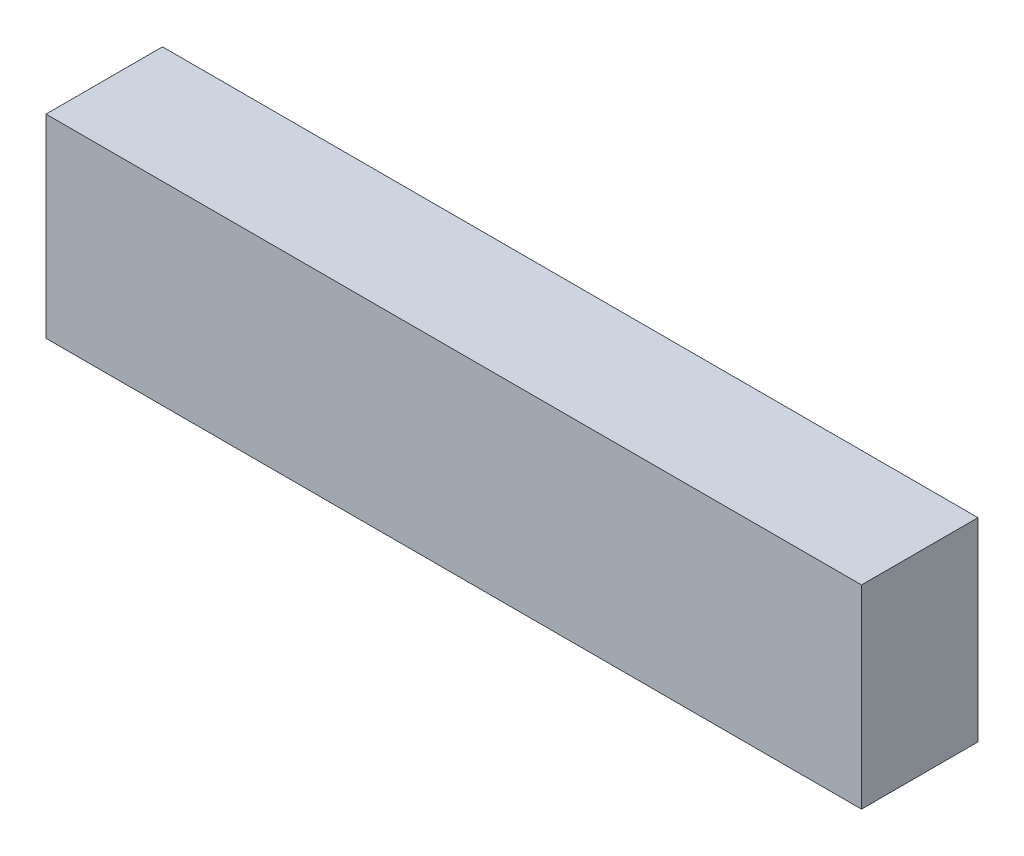
ISO-10303-21;
HEADER;
FILE_DESCRIPTION(('STEP AP214'),'2;1');
FILE_NAME('part.step','',(''),(''),'','','');
FILE_SCHEMA(('AUTOMOTIVE_DESIGN { 1 0 10303 214 1 1 1 1 }'));
ENDSEC;
DATA;
#1=APPLICATION_CONTEXT('core data for automotive mechanical design processes');
#2=APPLICATION_PROTOCOL_DEFINITION('international standard','automotive_design',2000,#1);
#3=PRODUCT_CONTEXT('',#1,'mechanical');
#4=PRODUCT('Part','Part','',(#3));
#5=PRODUCT_RELATED_PRODUCT_CATEGORY('part','',(#4));
#6=PRODUCT_DEFINITION_FORMATION('','',#4);
#7=PRODUCT_DEFINITION_CONTEXT('part definition',#1,'design');
#8=PRODUCT_DEFINITION('design','',#6,#7);
#9=PRODUCT_DEFINITION_SHAPE('','',#8);
#10=(LENGTH_UNIT() NAMED_UNIT(*) SI_UNIT(.MILLI.,.METRE.));
#11=(NAMED_UNIT(*) PLANE_ANGLE_UNIT() SI_UNIT($,.RADIAN.));
#12=(NAMED_UNIT(*) SI_UNIT($,.STERADIAN.) SOLID_ANGLE_UNIT());
#13=UNCERTAINTY_MEASURE_WITH_UNIT(LENGTH_MEASURE(1.E-05),#10,'distance_accuracy_value','');
#14=(GEOMETRIC_REPRESENTATION_CONTEXT(3) GLOBAL_UNCERTAINTY_ASSIGNED_CONTEXT((#13)) GLOBAL_UNIT_ASSIGNED_CONTEXT((#10,
#11,#12)) REPRESENTATION_CONTEXT('',''));
#15=CARTESIAN_POINT('',(0.,0.,0.));
#16=DIRECTION('',(0.,0.,1.));
#17=DIRECTION('',(1.,0.,0.));
#18=AXIS2_PLACEMENT_3D('',#15,#16,#17);
#19=CARTESIAN_POINT('',(0.,166.7,100.));
#20=DIRECTION('',(1.,0.,0.));
#21=DIRECTION('',(0.,1.,0.));
#22=AXIS2_PLACEMENT_3D('',#19,#20,#21);
#23=PLANE('',#22);
#24=DIRECTION('',(0.,-1.,0.));
#25=VECTOR('',#24,1.);
#26=CARTESIAN_POINT('',(0.,166.7,0.));
#27=LINE('',#26,#25);
#28=CARTESIAN_POINT('',(0.,166.7,0.));
#29=VERTEX_POINT('',#28);
#30=CARTESIAN_POINT('',(0.,0.,0.));
#31=VERTEX_POINT('',#30);
#32=EDGE_CURVE('E95',#29,#31,#27,.T.);
#33=ORIENTED_EDGE('',*,*,#32,.T.);
#34=DIRECTION('',(0.,0.,-1.));
#35=VECTOR('',#34,1.);
#36=CARTESIAN_POINT('',(0.,0.,100.));
#37=LINE('',#36,#35);
#38=CARTESIAN_POINT('',(0.,0.,100.));
#39=VERTEX_POINT('',#38);
#40=EDGE_CURVE('E11',#39,#31,#37,.T.);
#41=ORIENTED_EDGE('',*,*,#40,.F.);
#42=DIRECTION('',(0.,-1.,0.));
#43=VECTOR('',#42,1.);
#44=CARTESIAN_POINT('',(0.,166.7,100.));
#45=LINE('',#44,#43);
#46=CARTESIAN_POINT('',(0.,166.7,100.));
#47=VERTEX_POINT('',#46);
#48=EDGE_CURVE('E83',#47,#39,#45,.T.);
#49=ORIENTED_EDGE('',*,*,#48,.F.);
#50=DIRECTION('',(0.,0.,-1.));
#51=VECTOR('',#50,1.);
#52=CARTESIAN_POINT('',(0.,166.7,100.));
#53=LINE('',#52,#51);
#54=EDGE_CURVE('E91',#47,#29,#53,.T.);
#55=ORIENTED_EDGE('',*,*,#54,.T.);
#56=EDGE_LOOP('',(#33,#41,#49,#55));
#57=FACE_BOUND('',#56,.T.);
#58=ADVANCED_FACE('F32',(#57),#23,.F.);
#59=CARTESIAN_POINT('',(0.,0.,100.));
#60=DIRECTION('',(0.,1.,0.));
#61=DIRECTION('',(0.,0.,1.));
#62=AXIS2_PLACEMENT_3D('',#59,#60,#61);
#63=PLANE('',#62);
#64=DIRECTION('',(1.,0.,0.));
#65=VECTOR('',#64,1.);
#66=CARTESIAN_POINT('',(0.,0.,0.));
#67=LINE('',#66,#65);
#68=CARTESIAN_POINT('',(700.,0.,0.));
#69=VERTEX_POINT('',#68);
#70=EDGE_CURVE('E87',#31,#69,#67,.T.);
#71=ORIENTED_EDGE('',*,*,#70,.T.);
#72=DIRECTION('',(0.,0.,-1.));
#73=VECTOR('',#72,1.);
#74=CARTESIAN_POINT('',(700.,0.,100.));
#75=LINE('',#74,#73);
#76=CARTESIAN_POINT('',(700.,0.,100.));
#77=VERTEX_POINT('',#76);
#78=EDGE_CURVE('E40',#77,#69,#75,.T.);
#79=ORIENTED_EDGE('',*,*,#78,.F.);
#80=DIRECTION('',(1.,0.,0.));
#81=VECTOR('',#80,1.);
#82=CARTESIAN_POINT('',(0.,0.,100.));
#83=LINE('',#82,#81);
#84=EDGE_CURVE('E78',#39,#77,#83,.T.);
#85=ORIENTED_EDGE('',*,*,#84,.F.);
#86=ORIENTED_EDGE('',*,*,#40,.T.);
#87=EDGE_LOOP('',(#71,#79,#85,#86));
#88=FACE_BOUND('',#87,.T.);
#89=ADVANCED_FACE('F86',(#88),#63,.F.);
#90=CARTESIAN_POINT('',(700.,166.7,100.));
#91=DIRECTION('',(-1.,0.,0.));
#92=DIRECTION('',(0.,0.,1.));
#93=AXIS2_PLACEMENT_3D('',#90,#91,#92);
#94=PLANE('',#93);
#95=DIRECTION('',(0.,1.,0.));
#96=VECTOR('',#95,1.);
#97=CARTESIAN_POINT('',(700.,166.7,0.));
#98=LINE('',#97,#96);
#99=CARTESIAN_POINT('',(700.,166.7,0.));
#100=VERTEX_POINT('',#99);
#101=EDGE_CURVE('E65',#69,#100,#98,.T.);
#102=ORIENTED_EDGE('',*,*,#101,.T.);
#103=DIRECTION('',(0.,0.,-1.));
#104=VECTOR('',#103,1.);
#105=CARTESIAN_POINT('',(700.,166.7,100.));
#106=LINE('',#105,#104);
#107=CARTESIAN_POINT('',(700.,166.7,100.));
#108=VERTEX_POINT('',#107);
#109=EDGE_CURVE('E88',#108,#100,#106,.T.);
#110=ORIENTED_EDGE('',*,*,#109,.F.);
#111=DIRECTION('',(0.,1.,0.));
#112=VECTOR('',#111,1.);
#113=CARTESIAN_POINT('',(700.,166.7,100.));
#114=LINE('',#113,#112);
#115=EDGE_CURVE('E81',#77,#108,#114,.T.);
#116=ORIENTED_EDGE('',*,*,#115,.F.);
#117=ORIENTED_EDGE('',*,*,#78,.T.);
#118=EDGE_LOOP('',(#102,#110,#116,#117));
#119=FACE_BOUND('',#118,.T.);
#120=ADVANCED_FACE('F89',(#119),#94,.F.);
#121=CARTESIAN_POINT('',(0.,166.7,100.));
#122=DIRECTION('',(0.,-1.,0.));
#123=DIRECTION('',(0.,0.,-1.));
#124=AXIS2_PLACEMENT_3D('',#121,#122,#123);
#125=PLANE('',#124);
#126=DIRECTION('',(-1.,0.,0.));
#127=VECTOR('',#126,1.);
#128=CARTESIAN_POINT('',(0.,166.7,0.));
#129=LINE('',#128,#127);
#130=EDGE_CURVE('E71',#100,#29,#129,.T.);
#131=ORIENTED_EDGE('',*,*,#130,.T.);
#132=ORIENTED_EDGE('',*,*,#54,.F.);
#133=DIRECTION('',(-1.,0.,0.));
#134=VECTOR('',#133,1.);
#135=CARTESIAN_POINT('',(0.,166.7,100.));
#136=LINE('',#135,#134);
#137=EDGE_CURVE('E48',#108,#47,#136,.T.);
#138=ORIENTED_EDGE('',*,*,#137,.F.);
#139=ORIENTED_EDGE('',*,*,#109,.T.);
#140=EDGE_LOOP('',(#131,#132,#138,#139));
#141=FACE_BOUND('',#140,.T.);
#142=ADVANCED_FACE('F102',(#141),#125,.F.);
#143=CARTESIAN_POINT('',(0.,0.,100.));
#144=DIRECTION('',(0.,0.,1.));
#145=DIRECTION('',(1.,0.,0.));
#146=AXIS2_PLACEMENT_3D('',#143,#144,#145);
#147=PLANE('',#146);
#148=ORIENTED_EDGE('',*,*,#48,.T.);
#149=ORIENTED_EDGE('',*,*,#84,.T.);
#150=ORIENTED_EDGE('',*,*,#115,.T.);
#151=ORIENTED_EDGE('',*,*,#137,.T.);
#152=EDGE_LOOP('',(#148,#149,#150,#151));
#153=FACE_BOUND('',#152,.T.);
#154=ADVANCED_FACE('F79',(#153),#147,.T.);
#155=CARTESIAN_POINT('',(0.,0.,0.));
#156=DIRECTION('',(0.,0.,1.));
#157=DIRECTION('',(1.,0.,0.));
#158=AXIS2_PLACEMENT_3D('',#155,#156,#157);
#159=PLANE('',#158);
#160=ORIENTED_EDGE('',*,*,#32,.F.);
#161=ORIENTED_EDGE('',*,*,#130,.F.);
#162=ORIENTED_EDGE('',*,*,#101,.F.);
#163=ORIENTED_EDGE('',*,*,#70,.F.);
#164=EDGE_LOOP('',(#160,#161,#162,#163));
#165=FACE_BOUND('',#164,.T.);
#166=ADVANCED_FACE('F105',(#165),#159,.F.);
#167=CLOSED_SHELL('',(#58,#89,#120,#142,#154,#166));
#168=MANIFOLD_SOLID_BREP('B2',#167);
#169=ADVANCED_BREP_SHAPE_REPRESENTATION('',(#18,#168),#14);
#170=SHAPE_DEFINITION_REPRESENTATION(#9,#169);
ENDSEC;
END-ISO-10303-21;
